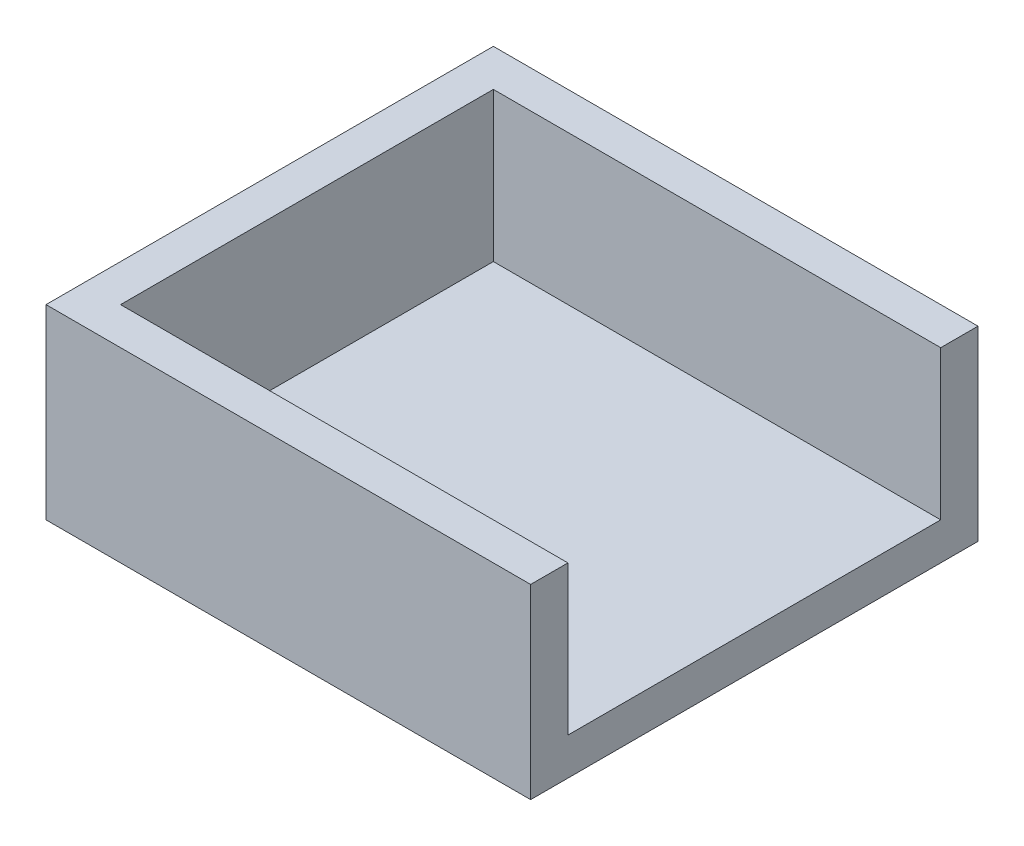
ISO-10303-21;
HEADER;
FILE_DESCRIPTION(('STEP AP214'),'2;1');
FILE_NAME('part.step','',(''),(''),'','','');
FILE_SCHEMA(('AUTOMOTIVE_DESIGN { 1 0 10303 214 1 1 1 1 }'));
ENDSEC;
DATA;
#1=APPLICATION_CONTEXT('core data for automotive mechanical design processes');
#2=APPLICATION_PROTOCOL_DEFINITION('international standard','automotive_design',2000,#1);
#3=PRODUCT_CONTEXT('',#1,'mechanical');
#4=PRODUCT('Part','Part','',(#3));
#5=PRODUCT_RELATED_PRODUCT_CATEGORY('part','',(#4));
#6=PRODUCT_DEFINITION_FORMATION('','',#4);
#7=PRODUCT_DEFINITION_CONTEXT('part definition',#1,'design');
#8=PRODUCT_DEFINITION('design','',#6,#7);
#9=PRODUCT_DEFINITION_SHAPE('','',#8);
#10=(LENGTH_UNIT() NAMED_UNIT(*) SI_UNIT(.MILLI.,.METRE.));
#11=(NAMED_UNIT(*) PLANE_ANGLE_UNIT() SI_UNIT($,.RADIAN.));
#12=(NAMED_UNIT(*) SI_UNIT($,.STERADIAN.) SOLID_ANGLE_UNIT());
#13=UNCERTAINTY_MEASURE_WITH_UNIT(LENGTH_MEASURE(1.E-05),#10,'distance_accuracy_value','');
#14=(GEOMETRIC_REPRESENTATION_CONTEXT(3) GLOBAL_UNCERTAINTY_ASSIGNED_CONTEXT((#13)) GLOBAL_UNIT_ASSIGNED_CONTEXT((#10,
#11,#12)) REPRESENTATION_CONTEXT('',''));
#15=CARTESIAN_POINT('',(0.,0.,0.));
#16=DIRECTION('',(0.,0.,1.));
#17=DIRECTION('',(1.,0.,0.));
#18=AXIS2_PLACEMENT_3D('',#15,#16,#17);
#19=CARTESIAN_POINT('',(165.1,63.5,0.));
#20=DIRECTION('',(-1.,0.,0.));
#21=DIRECTION('',(0.,0.,1.));
#22=AXIS2_PLACEMENT_3D('',#19,#20,#21);
#23=PLANE('',#22);
#24=DIRECTION('',(0.,1.,0.));
#25=VECTOR('',#24,1.);
#26=CARTESIAN_POINT('',(165.1,12.7,-12.7));
#27=LINE('',#26,#25);
#28=CARTESIAN_POINT('',(165.1,12.7,-12.7));
#29=VERTEX_POINT('',#28);
#30=CARTESIAN_POINT('',(165.1,63.5,-12.7));
#31=VERTEX_POINT('',#30);
#32=EDGE_CURVE('E145',#29,#31,#27,.T.);
#33=ORIENTED_EDGE('',*,*,#32,.T.);
#34=DIRECTION('',(0.,0.,-1.));
#35=VECTOR('',#34,1.);
#36=CARTESIAN_POINT('',(165.1,63.5,0.));
#37=LINE('',#36,#35);
#38=CARTESIAN_POINT('',(165.1,63.5,0.));
#39=VERTEX_POINT('',#38);
#40=EDGE_CURVE('E136',#39,#31,#37,.T.);
#41=ORIENTED_EDGE('',*,*,#40,.F.);
#42=DIRECTION('',(0.,-1.,0.));
#43=VECTOR('',#42,1.);
#44=CARTESIAN_POINT('',(165.1,63.5,0.));
#45=LINE('',#44,#43);
#46=CARTESIAN_POINT('',(165.1,0.,0.));
#47=VERTEX_POINT('',#46);
#48=EDGE_CURVE('E41',#39,#47,#45,.T.);
#49=ORIENTED_EDGE('',*,*,#48,.T.);
#50=DIRECTION('',(0.,0.,-1.));
#51=VECTOR('',#50,1.);
#52=CARTESIAN_POINT('',(165.1,0.,0.));
#53=LINE('',#52,#51);
#54=CARTESIAN_POINT('',(165.1,0.,-152.4));
#55=VERTEX_POINT('',#54);
#56=EDGE_CURVE('E147',#47,#55,#53,.T.);
#57=ORIENTED_EDGE('',*,*,#56,.T.);
#58=DIRECTION('',(0.,-1.,0.));
#59=VECTOR('',#58,1.);
#60=CARTESIAN_POINT('',(165.1,63.5,-152.4));
#61=LINE('',#60,#59);
#62=CARTESIAN_POINT('',(165.1,63.5,-152.4));
#63=VERTEX_POINT('',#62);
#64=EDGE_CURVE('E151',#63,#55,#61,.T.);
#65=ORIENTED_EDGE('',*,*,#64,.F.);
#66=CARTESIAN_POINT('',(165.1,63.5,-139.7));
#67=VERTEX_POINT('',#66);
#68=EDGE_CURVE('E126',#67,#63,#37,.T.);
#69=ORIENTED_EDGE('',*,*,#68,.F.);
#70=DIRECTION('',(0.,1.,0.));
#71=VECTOR('',#70,1.);
#72=CARTESIAN_POINT('',(165.1,12.7,-139.7));
#73=LINE('',#72,#71);
#74=CARTESIAN_POINT('',(165.1,12.7,-139.7));
#75=VERTEX_POINT('',#74);
#76=EDGE_CURVE('E48',#75,#67,#73,.T.);
#77=ORIENTED_EDGE('',*,*,#76,.F.);
#78=DIRECTION('',(0.,0.,-1.));
#79=VECTOR('',#78,1.);
#80=CARTESIAN_POINT('',(165.1,12.7,-12.7));
#81=LINE('',#80,#79);
#82=EDGE_CURVE('E114',#29,#75,#81,.T.);
#83=ORIENTED_EDGE('',*,*,#82,.F.);
#84=EDGE_LOOP('',(#33,#41,#49,#57,#65,#69,#77,#83));
#85=FACE_BOUND('',#84,.T.);
#86=ADVANCED_FACE('F33',(#85),#23,.F.);
#87=CARTESIAN_POINT('',(0.,63.5,0.));
#88=DIRECTION('',(0.,-1.,0.));
#89=DIRECTION('',(0.,0.,-1.));
#90=AXIS2_PLACEMENT_3D('',#87,#88,#89);
#91=PLANE('',#90);
#92=DIRECTION('',(-1.,0.,0.));
#93=VECTOR('',#92,1.);
#94=CARTESIAN_POINT('',(165.1,63.5,-12.7));
#95=LINE('',#94,#93);
#96=CARTESIAN_POINT('',(12.7,63.5,-12.7));
#97=VERTEX_POINT('',#96);
#98=EDGE_CURVE('E122',#31,#97,#95,.T.);
#99=ORIENTED_EDGE('',*,*,#98,.T.);
#100=DIRECTION('',(0.,0.,-1.));
#101=VECTOR('',#100,1.);
#102=CARTESIAN_POINT('',(12.7,63.5,-12.7));
#103=LINE('',#102,#101);
#104=CARTESIAN_POINT('',(12.7,63.5,-139.7));
#105=VERTEX_POINT('',#104);
#106=EDGE_CURVE('E250',#97,#105,#103,.T.);
#107=ORIENTED_EDGE('',*,*,#106,.T.);
#108=DIRECTION('',(1.,0.,0.));
#109=VECTOR('',#108,1.);
#110=CARTESIAN_POINT('',(12.7,63.5,-139.7));
#111=LINE('',#110,#109);
#112=EDGE_CURVE('E255',#105,#67,#111,.T.);
#113=ORIENTED_EDGE('',*,*,#112,.T.);
#114=ORIENTED_EDGE('',*,*,#68,.T.);
#115=DIRECTION('',(-1.,0.,0.));
#116=VECTOR('',#115,1.);
#117=CARTESIAN_POINT('',(0.,63.5,-152.4));
#118=LINE('',#117,#116);
#119=CARTESIAN_POINT('',(0.,63.5,-152.4));
#120=VERTEX_POINT('',#119);
#121=EDGE_CURVE('E57',#63,#120,#118,.T.);
#122=ORIENTED_EDGE('',*,*,#121,.T.);
#123=DIRECTION('',(0.,0.,1.));
#124=VECTOR('',#123,1.);
#125=CARTESIAN_POINT('',(0.,63.5,0.));
#126=LINE('',#125,#124);
#127=CARTESIAN_POINT('',(0.,63.5,0.));
#128=VERTEX_POINT('',#127);
#129=EDGE_CURVE('E133',#120,#128,#126,.T.);
#130=ORIENTED_EDGE('',*,*,#129,.T.);
#131=DIRECTION('',(1.,0.,0.));
#132=VECTOR('',#131,1.);
#133=CARTESIAN_POINT('',(0.,63.5,0.));
#134=LINE('',#133,#132);
#135=EDGE_CURVE('E85',#128,#39,#134,.T.);
#136=ORIENTED_EDGE('',*,*,#135,.T.);
#137=ORIENTED_EDGE('',*,*,#40,.T.);
#138=EDGE_LOOP('',(#99,#107,#113,#114,#122,#130,#136,#137));
#139=FACE_BOUND('',#138,.T.);
#140=ADVANCED_FACE('F173',(#139),#91,.F.);
#141=CARTESIAN_POINT('',(0.,63.5,0.));
#142=DIRECTION('',(1.,0.,0.));
#143=DIRECTION('',(0.,0.,-1.));
#144=AXIS2_PLACEMENT_3D('',#141,#142,#143);
#145=PLANE('',#144);
#146=DIRECTION('',(0.,0.,1.));
#147=VECTOR('',#146,1.);
#148=CARTESIAN_POINT('',(0.,0.,0.));
#149=LINE('',#148,#147);
#150=CARTESIAN_POINT('',(0.,0.,-152.4));
#151=VERTEX_POINT('',#150);
#152=CARTESIAN_POINT('',(0.,0.,0.));
#153=VERTEX_POINT('',#152);
#154=EDGE_CURVE('E141',#151,#153,#149,.T.);
#155=ORIENTED_EDGE('',*,*,#154,.T.);
#156=DIRECTION('',(0.,-1.,0.));
#157=VECTOR('',#156,1.);
#158=CARTESIAN_POINT('',(0.,63.5,0.));
#159=LINE('',#158,#157);
#160=EDGE_CURVE('E11',#128,#153,#159,.T.);
#161=ORIENTED_EDGE('',*,*,#160,.F.);
#162=ORIENTED_EDGE('',*,*,#129,.F.);
#163=DIRECTION('',(0.,-1.,0.));
#164=VECTOR('',#163,1.);
#165=CARTESIAN_POINT('',(0.,63.5,-152.4));
#166=LINE('',#165,#164);
#167=EDGE_CURVE('E140',#120,#151,#166,.T.);
#168=ORIENTED_EDGE('',*,*,#167,.T.);
#169=EDGE_LOOP('',(#155,#161,#162,#168));
#170=FACE_BOUND('',#169,.T.);
#171=ADVANCED_FACE('F35',(#170),#145,.F.);
#172=CARTESIAN_POINT('',(0.,63.5,0.));
#173=DIRECTION('',(0.,0.,-1.));
#174=DIRECTION('',(-1.,0.,0.));
#175=AXIS2_PLACEMENT_3D('',#172,#173,#174);
#176=PLANE('',#175);
#177=DIRECTION('',(1.,0.,0.));
#178=VECTOR('',#177,1.);
#179=CARTESIAN_POINT('',(0.,0.,0.));
#180=LINE('',#179,#178);
#181=EDGE_CURVE('E144',#153,#47,#180,.T.);
#182=ORIENTED_EDGE('',*,*,#181,.T.);
#183=ORIENTED_EDGE('',*,*,#48,.F.);
#184=ORIENTED_EDGE('',*,*,#135,.F.);
#185=ORIENTED_EDGE('',*,*,#160,.T.);
#186=EDGE_LOOP('',(#182,#183,#184,#185));
#187=FACE_BOUND('',#186,.T.);
#188=ADVANCED_FACE('F163',(#187),#176,.F.);
#189=CARTESIAN_POINT('',(0.,63.5,-152.4));
#190=DIRECTION('',(0.,0.,1.));
#191=DIRECTION('',(1.,0.,0.));
#192=AXIS2_PLACEMENT_3D('',#189,#190,#191);
#193=PLANE('',#192);
#194=DIRECTION('',(-1.,0.,0.));
#195=VECTOR('',#194,1.);
#196=CARTESIAN_POINT('',(0.,0.,-152.4));
#197=LINE('',#196,#195);
#198=EDGE_CURVE('E78',#55,#151,#197,.T.);
#199=ORIENTED_EDGE('',*,*,#198,.T.);
#200=ORIENTED_EDGE('',*,*,#167,.F.);
#201=ORIENTED_EDGE('',*,*,#121,.F.);
#202=ORIENTED_EDGE('',*,*,#64,.T.);
#203=EDGE_LOOP('',(#199,#200,#201,#202));
#204=FACE_BOUND('',#203,.T.);
#205=ADVANCED_FACE('F161',(#204),#193,.F.);
#206=CARTESIAN_POINT('',(0.,0.,0.));
#207=DIRECTION('',(0.,-1.,0.));
#208=DIRECTION('',(0.,0.,-1.));
#209=AXIS2_PLACEMENT_3D('',#206,#207,#208);
#210=PLANE('',#209);
#211=ORIENTED_EDGE('',*,*,#154,.F.);
#212=ORIENTED_EDGE('',*,*,#198,.F.);
#213=ORIENTED_EDGE('',*,*,#56,.F.);
#214=ORIENTED_EDGE('',*,*,#181,.F.);
#215=EDGE_LOOP('',(#211,#212,#213,#214));
#216=FACE_BOUND('',#215,.T.);
#217=ADVANCED_FACE('F157',(#216),#210,.T.);
#218=CARTESIAN_POINT('',(165.1,12.7,-12.7));
#219=DIRECTION('',(0.,0.,-1.));
#220=DIRECTION('',(-1.,0.,0.));
#221=AXIS2_PLACEMENT_3D('',#218,#219,#220);
#222=PLANE('',#221);
#223=ORIENTED_EDGE('',*,*,#98,.F.);
#224=ORIENTED_EDGE('',*,*,#32,.F.);
#225=DIRECTION('',(-1.,0.,0.));
#226=VECTOR('',#225,1.);
#227=CARTESIAN_POINT('',(165.1,12.7,-12.7));
#228=LINE('',#227,#226);
#229=CARTESIAN_POINT('',(12.7,12.7,-12.7));
#230=VERTEX_POINT('',#229);
#231=EDGE_CURVE('E119',#29,#230,#228,.T.);
#232=ORIENTED_EDGE('',*,*,#231,.T.);
#233=DIRECTION('',(0.,1.,0.));
#234=VECTOR('',#233,1.);
#235=CARTESIAN_POINT('',(12.7,12.7,-12.7));
#236=LINE('',#235,#234);
#237=EDGE_CURVE('E128',#230,#97,#236,.T.);
#238=ORIENTED_EDGE('',*,*,#237,.T.);
#239=EDGE_LOOP('',(#223,#224,#232,#238));
#240=FACE_BOUND('',#239,.T.);
#241=ADVANCED_FACE('F169',(#240),#222,.T.);
#242=CARTESIAN_POINT('',(12.7,12.7,-12.7));
#243=DIRECTION('',(1.,0.,0.));
#244=DIRECTION('',(0.,0.,-1.));
#245=AXIS2_PLACEMENT_3D('',#242,#243,#244);
#246=PLANE('',#245);
#247=ORIENTED_EDGE('',*,*,#106,.F.);
#248=ORIENTED_EDGE('',*,*,#237,.F.);
#249=DIRECTION('',(0.,0.,-1.));
#250=VECTOR('',#249,1.);
#251=CARTESIAN_POINT('',(12.7,12.7,-12.7));
#252=LINE('',#251,#250);
#253=CARTESIAN_POINT('',(12.7,12.7,-139.7));
#254=VERTEX_POINT('',#253);
#255=EDGE_CURVE('E113',#230,#254,#252,.T.);
#256=ORIENTED_EDGE('',*,*,#255,.T.);
#257=DIRECTION('',(0.,1.,0.));
#258=VECTOR('',#257,1.);
#259=CARTESIAN_POINT('',(12.7,12.7,-139.7));
#260=LINE('',#259,#258);
#261=EDGE_CURVE('E110',#254,#105,#260,.T.);
#262=ORIENTED_EDGE('',*,*,#261,.T.);
#263=EDGE_LOOP('',(#247,#248,#256,#262));
#264=FACE_BOUND('',#263,.T.);
#265=ADVANCED_FACE('F185',(#264),#246,.T.);
#266=CARTESIAN_POINT('',(12.7,12.7,-139.7));
#267=DIRECTION('',(0.,0.,1.));
#268=DIRECTION('',(1.,0.,0.));
#269=AXIS2_PLACEMENT_3D('',#266,#267,#268);
#270=PLANE('',#269);
#271=ORIENTED_EDGE('',*,*,#112,.F.);
#272=ORIENTED_EDGE('',*,*,#261,.F.);
#273=DIRECTION('',(1.,0.,0.));
#274=VECTOR('',#273,1.);
#275=CARTESIAN_POINT('',(12.7,12.7,-139.7));
#276=LINE('',#275,#274);
#277=EDGE_CURVE('E107',#254,#75,#276,.T.);
#278=ORIENTED_EDGE('',*,*,#277,.T.);
#279=ORIENTED_EDGE('',*,*,#76,.T.);
#280=EDGE_LOOP('',(#271,#272,#278,#279));
#281=FACE_BOUND('',#280,.T.);
#282=ADVANCED_FACE('F109',(#281),#270,.T.);
#283=CARTESIAN_POINT('',(0.,12.7,0.));
#284=DIRECTION('',(0.,-1.,0.));
#285=DIRECTION('',(0.,0.,-1.));
#286=AXIS2_PLACEMENT_3D('',#283,#284,#285);
#287=PLANE('',#286);
#288=ORIENTED_EDGE('',*,*,#82,.T.);
#289=ORIENTED_EDGE('',*,*,#277,.F.);
#290=ORIENTED_EDGE('',*,*,#255,.F.);
#291=ORIENTED_EDGE('',*,*,#231,.F.);
#292=EDGE_LOOP('',(#288,#289,#290,#291));
#293=FACE_BOUND('',#292,.T.);
#294=ADVANCED_FACE('F118',(#293),#287,.F.);
#295=CLOSED_SHELL('',(#86,#140,#171,#188,#205,#217,#241,#265,#282,#294));
#296=MANIFOLD_SOLID_BREP('B2',#295);
#297=ADVANCED_BREP_SHAPE_REPRESENTATION('',(#18,#296),#14);
#298=SHAPE_DEFINITION_REPRESENTATION(#9,#297);
ENDSEC;
END-ISO-10303-21;
